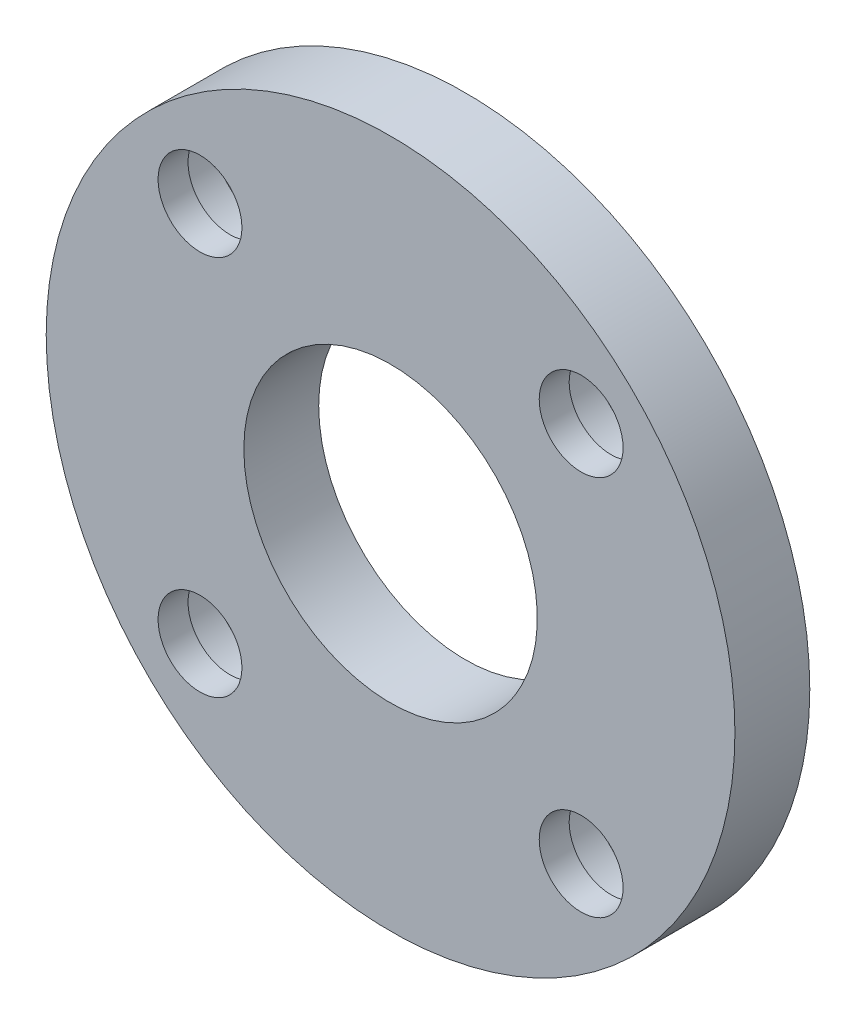
ISO-10303-21;
HEADER;
FILE_DESCRIPTION(('STEP AP214'),'2;1');
FILE_NAME('part.step','',(''),(''),'','','');
FILE_SCHEMA(('AUTOMOTIVE_DESIGN { 1 0 10303 214 1 1 1 1 }'));
ENDSEC;
DATA;
#1=APPLICATION_CONTEXT('core data for automotive mechanical design processes');
#2=APPLICATION_PROTOCOL_DEFINITION('international standard','automotive_design',2000,#1);
#3=PRODUCT_CONTEXT('',#1,'mechanical');
#4=PRODUCT('Part','Part','',(#3));
#5=PRODUCT_RELATED_PRODUCT_CATEGORY('part','',(#4));
#6=PRODUCT_DEFINITION_FORMATION('','',#4);
#7=PRODUCT_DEFINITION_CONTEXT('part definition',#1,'design');
#8=PRODUCT_DEFINITION('design','',#6,#7);
#9=PRODUCT_DEFINITION_SHAPE('','',#8);
#10=(LENGTH_UNIT() NAMED_UNIT(*) SI_UNIT(.MILLI.,.METRE.));
#11=(NAMED_UNIT(*) PLANE_ANGLE_UNIT() SI_UNIT($,.RADIAN.));
#12=(NAMED_UNIT(*) SI_UNIT($,.STERADIAN.) SOLID_ANGLE_UNIT());
#13=UNCERTAINTY_MEASURE_WITH_UNIT(LENGTH_MEASURE(1.E-05),#10,'distance_accuracy_value','');
#14=(GEOMETRIC_REPRESENTATION_CONTEXT(3) GLOBAL_UNCERTAINTY_ASSIGNED_CONTEXT((#13)) GLOBAL_UNIT_ASSIGNED_CONTEXT((#10,
#11,#12)) REPRESENTATION_CONTEXT('',''));
#15=CARTESIAN_POINT('',(0.,0.,0.));
#16=DIRECTION('',(0.,0.,1.));
#17=DIRECTION('',(1.,0.,0.));
#18=AXIS2_PLACEMENT_3D('',#15,#16,#17);
#19=CARTESIAN_POINT('',(-12.7279220613579,12.7279220613579,5.));
#20=DIRECTION('',(0.,0.,-1.));
#21=DIRECTION('',(-1.,0.,0.));
#22=AXIS2_PLACEMENT_3D('',#19,#20,#21);
#23=CYLINDRICAL_SURFACE('',#22,2.8);
#24=CARTESIAN_POINT('',(-12.7279220613579,12.7279220613579,5.));
#25=DIRECTION('',(0.,0.,1.));
#26=DIRECTION('',(1.,0.,0.));
#27=AXIS2_PLACEMENT_3D('',#24,#25,#26);
#28=CIRCLE('',#27,2.8);
#29=CARTESIAN_POINT('',(-9.92792206135786,12.7279220613579,5.));
#30=VERTEX_POINT('',#29);
#31=EDGE_CURVE('E69',#30,#30,#28,.T.);
#32=ORIENTED_EDGE('',*,*,#31,.T.);
#33=EDGE_LOOP('',(#32));
#34=FACE_BOUND('',#33,.T.);
#35=CARTESIAN_POINT('',(-12.7279220613579,12.7279220613579,3.));
#36=DIRECTION('',(0.,0.,-1.));
#37=DIRECTION('',(-1.,0.,0.));
#38=AXIS2_PLACEMENT_3D('',#35,#36,#37);
#39=CIRCLE('',#38,2.8);
#40=CARTESIAN_POINT('',(-15.5279220613579,12.7279220613579,3.));
#41=VERTEX_POINT('',#40);
#42=EDGE_CURVE('E60',#41,#41,#39,.T.);
#43=ORIENTED_EDGE('',*,*,#42,.T.);
#44=EDGE_LOOP('',(#43));
#45=FACE_BOUND('',#44,.T.);
#46=ADVANCED_FACE('F56',(#34,#45),#23,.F.);
#47=CARTESIAN_POINT('',(12.7279220613579,12.7279220613579,5.));
#48=DIRECTION('',(0.,0.,-1.));
#49=DIRECTION('',(-1.,0.,0.));
#50=AXIS2_PLACEMENT_3D('',#47,#48,#49);
#51=CYLINDRICAL_SURFACE('',#50,2.8);
#52=CARTESIAN_POINT('',(12.7279220613579,12.7279220613579,5.));
#53=DIRECTION('',(0.,0.,1.));
#54=DIRECTION('',(1.,0.,0.));
#55=AXIS2_PLACEMENT_3D('',#52,#53,#54);
#56=CIRCLE('',#55,2.8);
#57=CARTESIAN_POINT('',(15.5279220613579,12.7279220613579,5.));
#58=VERTEX_POINT('',#57);
#59=EDGE_CURVE('E94',#58,#58,#56,.T.);
#60=ORIENTED_EDGE('',*,*,#59,.T.);
#61=EDGE_LOOP('',(#60));
#62=FACE_BOUND('',#61,.T.);
#63=CARTESIAN_POINT('',(12.7279220613579,12.7279220613579,3.));
#64=DIRECTION('',(0.,0.,-1.));
#65=DIRECTION('',(-1.,0.,0.));
#66=AXIS2_PLACEMENT_3D('',#63,#64,#65);
#67=CIRCLE('',#66,2.8);
#68=CARTESIAN_POINT('',(9.92792206135785,12.7279220613579,3.));
#69=VERTEX_POINT('',#68);
#70=EDGE_CURVE('E80',#69,#69,#67,.T.);
#71=ORIENTED_EDGE('',*,*,#70,.T.);
#72=EDGE_LOOP('',(#71));
#73=FACE_BOUND('',#72,.T.);
#74=ADVANCED_FACE('F125',(#62,#73),#51,.F.);
#75=CARTESIAN_POINT('',(12.7279220613579,-12.7279220613579,5.));
#76=DIRECTION('',(0.,0.,-1.));
#77=DIRECTION('',(-1.,0.,0.));
#78=AXIS2_PLACEMENT_3D('',#75,#76,#77);
#79=CYLINDRICAL_SURFACE('',#78,2.8);
#80=CARTESIAN_POINT('',(12.7279220613579,-12.7279220613579,5.));
#81=DIRECTION('',(0.,0.,1.));
#82=DIRECTION('',(1.,0.,0.));
#83=AXIS2_PLACEMENT_3D('',#80,#81,#82);
#84=CIRCLE('',#83,2.8);
#85=CARTESIAN_POINT('',(15.5279220613579,-12.7279220613579,5.));
#86=VERTEX_POINT('',#85);
#87=EDGE_CURVE('E89',#86,#86,#84,.T.);
#88=ORIENTED_EDGE('',*,*,#87,.T.);
#89=EDGE_LOOP('',(#88));
#90=FACE_BOUND('',#89,.T.);
#91=CARTESIAN_POINT('',(12.7279220613579,-12.7279220613579,3.));
#92=DIRECTION('',(0.,0.,-1.));
#93=DIRECTION('',(-1.,0.,0.));
#94=AXIS2_PLACEMENT_3D('',#91,#92,#93);
#95=CIRCLE('',#94,2.8);
#96=CARTESIAN_POINT('',(9.92792206135785,-12.7279220613579,3.));
#97=VERTEX_POINT('',#96);
#98=EDGE_CURVE('E77',#97,#97,#95,.T.);
#99=ORIENTED_EDGE('',*,*,#98,.T.);
#100=EDGE_LOOP('',(#99));
#101=FACE_BOUND('',#100,.T.);
#102=ADVANCED_FACE('F119',(#90,#101),#79,.F.);
#103=CARTESIAN_POINT('',(-12.7279220613579,-12.7279220613579,5.));
#104=DIRECTION('',(0.,0.,-1.));
#105=DIRECTION('',(-1.,0.,0.));
#106=AXIS2_PLACEMENT_3D('',#103,#104,#105);
#107=CYLINDRICAL_SURFACE('',#106,2.8);
#108=CARTESIAN_POINT('',(-12.7279220613579,-12.7279220613579,5.));
#109=DIRECTION('',(0.,0.,1.));
#110=DIRECTION('',(1.,0.,0.));
#111=AXIS2_PLACEMENT_3D('',#108,#109,#110);
#112=CIRCLE('',#111,2.8);
#113=CARTESIAN_POINT('',(-9.92792206135786,-12.7279220613579,5.));
#114=VERTEX_POINT('',#113);
#115=EDGE_CURVE('E85',#114,#114,#112,.T.);
#116=ORIENTED_EDGE('',*,*,#115,.T.);
#117=EDGE_LOOP('',(#116));
#118=FACE_BOUND('',#117,.T.);
#119=CARTESIAN_POINT('',(-12.7279220613579,-12.7279220613579,3.));
#120=DIRECTION('',(0.,0.,-1.));
#121=DIRECTION('',(-1.,0.,0.));
#122=AXIS2_PLACEMENT_3D('',#119,#120,#121);
#123=CIRCLE('',#122,2.8);
#124=CARTESIAN_POINT('',(-15.5279220613579,-12.7279220613579,3.));
#125=VERTEX_POINT('',#124);
#126=EDGE_CURVE('E74',#125,#125,#123,.T.);
#127=ORIENTED_EDGE('',*,*,#126,.T.);
#128=EDGE_LOOP('',(#127));
#129=FACE_BOUND('',#128,.T.);
#130=ADVANCED_FACE('F109',(#118,#129),#107,.F.);
#131=CARTESIAN_POINT('',(0.,0.,5.));
#132=DIRECTION('',(0.,0.,1.));
#133=DIRECTION('',(1.,0.,0.));
#134=AXIS2_PLACEMENT_3D('',#131,#132,#133);
#135=PLANE('',#134);
#136=CARTESIAN_POINT('',(0.,0.,5.));
#137=DIRECTION('',(0.,0.,-1.));
#138=DIRECTION('',(-1.,0.,0.));
#139=AXIS2_PLACEMENT_3D('',#136,#137,#138);
#140=CIRCLE('',#139,9.8);
#141=CARTESIAN_POINT('',(-9.8,0.,5.));
#142=VERTEX_POINT('',#141);
#143=EDGE_CURVE('E173',#142,#142,#140,.T.);
#144=ORIENTED_EDGE('',*,*,#143,.T.);
#145=EDGE_LOOP('',(#144));
#146=FACE_BOUND('',#145,.T.);
#147=ORIENTED_EDGE('',*,*,#87,.F.);
#148=EDGE_LOOP('',(#147));
#149=FACE_BOUND('',#148,.T.);
#150=ORIENTED_EDGE('',*,*,#31,.F.);
#151=EDGE_LOOP('',(#150));
#152=FACE_BOUND('',#151,.T.);
#153=CARTESIAN_POINT('',(0.,0.,5.));
#154=DIRECTION('',(0.,0.,1.));
#155=DIRECTION('',(1.,0.,0.));
#156=AXIS2_PLACEMENT_3D('',#153,#154,#155);
#157=CIRCLE('',#156,23.);
#158=CARTESIAN_POINT('',(23.,0.,5.));
#159=VERTEX_POINT('',#158);
#160=EDGE_CURVE('E11',#159,#159,#157,.T.);
#161=ORIENTED_EDGE('',*,*,#160,.T.);
#162=EDGE_LOOP('',(#161));
#163=FACE_BOUND('',#162,.T.);
#164=ORIENTED_EDGE('',*,*,#59,.F.);
#165=EDGE_LOOP('',(#164));
#166=FACE_BOUND('',#165,.T.);
#167=ORIENTED_EDGE('',*,*,#115,.F.);
#168=EDGE_LOOP('',(#167));
#169=FACE_BOUND('',#168,.T.);
#170=ADVANCED_FACE('F106',(#146,#149,#152,#163,#166,#169),#135,.T.);
#171=CARTESIAN_POINT('',(0.,0.,0.));
#172=DIRECTION('',(0.,0.,1.));
#173=DIRECTION('',(1.,0.,0.));
#174=AXIS2_PLACEMENT_3D('',#171,#172,#173);
#175=PLANE('',#174);
#176=CARTESIAN_POINT('',(0.,0.,0.));
#177=DIRECTION('',(0.,0.,-1.));
#178=DIRECTION('',(-1.,0.,0.));
#179=AXIS2_PLACEMENT_3D('',#176,#177,#178);
#180=CIRCLE('',#179,9.8);
#181=CARTESIAN_POINT('',(-9.8,0.,0.));
#182=VERTEX_POINT('',#181);
#183=EDGE_CURVE('E176',#182,#182,#180,.T.);
#184=ORIENTED_EDGE('',*,*,#183,.F.);
#185=EDGE_LOOP('',(#184));
#186=FACE_BOUND('',#185,.T.);
#187=CARTESIAN_POINT('',(12.7279220613579,12.7279220613579,0.));
#188=DIRECTION('',(0.,0.,-1.));
#189=DIRECTION('',(-1.,0.,0.));
#190=AXIS2_PLACEMENT_3D('',#187,#188,#189);
#191=CIRCLE('',#190,4.3);
#192=CARTESIAN_POINT('',(8.42792206135785,12.7279220613579,0.));
#193=VERTEX_POINT('',#192);
#194=EDGE_CURVE('E193',#193,#193,#191,.T.);
#195=ORIENTED_EDGE('',*,*,#194,.F.);
#196=EDGE_LOOP('',(#195));
#197=FACE_BOUND('',#196,.T.);
#198=CARTESIAN_POINT('',(-12.7588246909081,12.7279220613579,0.));
#199=DIRECTION('',(0.,0.,-1.));
#200=DIRECTION('',(-1.,0.,0.));
#201=AXIS2_PLACEMENT_3D('',#198,#199,#200);
#202=CIRCLE('',#201,4.3);
#203=CARTESIAN_POINT('',(-17.0588246909081,12.7279220613579,0.));
#204=VERTEX_POINT('',#203);
#205=EDGE_CURVE('E187',#204,#204,#202,.T.);
#206=ORIENTED_EDGE('',*,*,#205,.F.);
#207=EDGE_LOOP('',(#206));
#208=FACE_BOUND('',#207,.T.);
#209=CARTESIAN_POINT('',(-12.7279220613579,-12.7279220613579,0.));
#210=DIRECTION('',(0.,0.,-1.));
#211=DIRECTION('',(-1.,0.,0.));
#212=AXIS2_PLACEMENT_3D('',#209,#210,#211);
#213=CIRCLE('',#212,4.3);
#214=CARTESIAN_POINT('',(-17.0279220613579,-12.7279220613579,0.));
#215=VERTEX_POINT('',#214);
#216=EDGE_CURVE('E181',#215,#215,#213,.T.);
#217=ORIENTED_EDGE('',*,*,#216,.F.);
#218=EDGE_LOOP('',(#217));
#219=FACE_BOUND('',#218,.T.);
#220=CARTESIAN_POINT('',(12.7279220613579,-12.7279220613579,0.));
#221=DIRECTION('',(0.,0.,-1.));
#222=DIRECTION('',(-1.,0.,0.));
#223=AXIS2_PLACEMENT_3D('',#220,#221,#222);
#224=CIRCLE('',#223,4.3);
#225=CARTESIAN_POINT('',(8.42792206135785,-12.7279220613579,0.));
#226=VERTEX_POINT('',#225);
#227=EDGE_CURVE('E97',#226,#226,#224,.T.);
#228=ORIENTED_EDGE('',*,*,#227,.F.);
#229=EDGE_LOOP('',(#228));
#230=FACE_BOUND('',#229,.T.);
#231=CARTESIAN_POINT('',(0.,0.,0.));
#232=DIRECTION('',(0.,0.,1.));
#233=DIRECTION('',(1.,0.,0.));
#234=AXIS2_PLACEMENT_3D('',#231,#232,#233);
#235=CIRCLE('',#234,23.);
#236=CARTESIAN_POINT('',(23.,0.,0.));
#237=VERTEX_POINT('',#236);
#238=EDGE_CURVE('E64',#237,#237,#235,.T.);
#239=ORIENTED_EDGE('',*,*,#238,.F.);
#240=EDGE_LOOP('',(#239));
#241=FACE_BOUND('',#240,.T.);
#242=ADVANCED_FACE('F108',(#186,#197,#208,#219,#230,#241),#175,.F.);
#243=CARTESIAN_POINT('',(0.,0.,5.));
#244=DIRECTION('',(0.,0.,-1.));
#245=DIRECTION('',(-1.,0.,0.));
#246=AXIS2_PLACEMENT_3D('',#243,#244,#245);
#247=CYLINDRICAL_SURFACE('',#246,23.);
#248=ORIENTED_EDGE('',*,*,#160,.F.);
#249=EDGE_LOOP('',(#248));
#250=FACE_BOUND('',#249,.T.);
#251=ORIENTED_EDGE('',*,*,#238,.T.);
#252=EDGE_LOOP('',(#251));
#253=FACE_BOUND('',#252,.T.);
#254=ADVANCED_FACE('F58',(#250,#253),#247,.T.);
#255=CARTESIAN_POINT('',(-12.7279220613579,-12.7279220613579,3.));
#256=DIRECTION('',(0.,0.,-1.));
#257=DIRECTION('',(-1.,0.,0.));
#258=AXIS2_PLACEMENT_3D('',#255,#256,#257);
#259=CYLINDRICAL_SURFACE('',#258,4.3);
#260=CARTESIAN_POINT('',(-12.7279220613579,-12.7279220613579,3.));
#261=DIRECTION('',(0.,0.,-1.));
#262=DIRECTION('',(-1.,0.,0.));
#263=AXIS2_PLACEMENT_3D('',#260,#261,#262);
#264=CIRCLE('',#263,4.3);
#265=CARTESIAN_POINT('',(-17.0279220613579,-12.7279220613579,3.));
#266=VERTEX_POINT('',#265);
#267=EDGE_CURVE('E184',#266,#266,#264,.T.);
#268=ORIENTED_EDGE('',*,*,#267,.F.);
#269=EDGE_LOOP('',(#268));
#270=FACE_BOUND('',#269,.T.);
#271=ORIENTED_EDGE('',*,*,#216,.T.);
#272=EDGE_LOOP('',(#271));
#273=FACE_BOUND('',#272,.T.);
#274=ADVANCED_FACE('F162',(#270,#273),#259,.F.);
#275=CARTESIAN_POINT('',(-12.7279220613579,-12.7279220613579,3.));
#276=DIRECTION('',(0.,0.,-1.));
#277=DIRECTION('',(-1.,0.,0.));
#278=AXIS2_PLACEMENT_3D('',#275,#276,#277);
#279=PLANE('',#278);
#280=ORIENTED_EDGE('',*,*,#126,.F.);
#281=EDGE_LOOP('',(#280));
#282=FACE_BOUND('',#281,.T.);
#283=ORIENTED_EDGE('',*,*,#267,.T.);
#284=EDGE_LOOP('',(#283));
#285=FACE_BOUND('',#284,.T.);
#286=ADVANCED_FACE('F138',(#282,#285),#279,.T.);
#287=CARTESIAN_POINT('',(12.7279220613579,-12.7279220613579,3.));
#288=DIRECTION('',(0.,0.,-1.));
#289=DIRECTION('',(-1.,0.,0.));
#290=AXIS2_PLACEMENT_3D('',#287,#288,#289);
#291=CYLINDRICAL_SURFACE('',#290,4.3);
#292=CARTESIAN_POINT('',(12.7279220613579,-12.7279220613579,3.));
#293=DIRECTION('',(0.,0.,-1.));
#294=DIRECTION('',(-1.,0.,0.));
#295=AXIS2_PLACEMENT_3D('',#292,#293,#294);
#296=CIRCLE('',#295,4.3);
#297=CARTESIAN_POINT('',(8.42792206135785,-12.7279220613579,3.));
#298=VERTEX_POINT('',#297);
#299=EDGE_CURVE('E78',#298,#298,#296,.T.);
#300=ORIENTED_EDGE('',*,*,#299,.F.);
#301=EDGE_LOOP('',(#300));
#302=FACE_BOUND('',#301,.T.);
#303=ORIENTED_EDGE('',*,*,#227,.T.);
#304=EDGE_LOOP('',(#303));
#305=FACE_BOUND('',#304,.T.);
#306=ADVANCED_FACE('F134',(#302,#305),#291,.F.);
#307=CARTESIAN_POINT('',(12.7279220613579,-12.7279220613579,3.));
#308=DIRECTION('',(0.,0.,-1.));
#309=DIRECTION('',(-1.,0.,0.));
#310=AXIS2_PLACEMENT_3D('',#307,#308,#309);
#311=PLANE('',#310);
#312=ORIENTED_EDGE('',*,*,#98,.F.);
#313=EDGE_LOOP('',(#312));
#314=FACE_BOUND('',#313,.T.);
#315=ORIENTED_EDGE('',*,*,#299,.T.);
#316=EDGE_LOOP('',(#315));
#317=FACE_BOUND('',#316,.T.);
#318=ADVANCED_FACE('F137',(#314,#317),#311,.T.);
#319=CARTESIAN_POINT('',(12.7279220613579,12.7279220613579,3.));
#320=DIRECTION('',(0.,0.,-1.));
#321=DIRECTION('',(-1.,0.,0.));
#322=AXIS2_PLACEMENT_3D('',#319,#320,#321);
#323=CYLINDRICAL_SURFACE('',#322,4.3);
#324=CARTESIAN_POINT('',(12.7279220613579,12.7279220613579,3.));
#325=DIRECTION('',(0.,0.,-1.));
#326=DIRECTION('',(-1.,0.,0.));
#327=AXIS2_PLACEMENT_3D('',#324,#325,#326);
#328=CIRCLE('',#327,4.3);
#329=CARTESIAN_POINT('',(8.42792206135785,12.7279220613579,3.));
#330=VERTEX_POINT('',#329);
#331=EDGE_CURVE('E178',#330,#330,#328,.T.);
#332=ORIENTED_EDGE('',*,*,#331,.F.);
#333=EDGE_LOOP('',(#332));
#334=FACE_BOUND('',#333,.T.);
#335=ORIENTED_EDGE('',*,*,#194,.T.);
#336=EDGE_LOOP('',(#335));
#337=FACE_BOUND('',#336,.T.);
#338=ADVANCED_FACE('F142',(#334,#337),#323,.F.);
#339=CARTESIAN_POINT('',(12.7279220613579,12.7279220613579,3.));
#340=DIRECTION('',(0.,0.,-1.));
#341=DIRECTION('',(-1.,0.,0.));
#342=AXIS2_PLACEMENT_3D('',#339,#340,#341);
#343=PLANE('',#342);
#344=ORIENTED_EDGE('',*,*,#70,.F.);
#345=EDGE_LOOP('',(#344));
#346=FACE_BOUND('',#345,.T.);
#347=ORIENTED_EDGE('',*,*,#331,.T.);
#348=EDGE_LOOP('',(#347));
#349=FACE_BOUND('',#348,.T.);
#350=ADVANCED_FACE('F144',(#346,#349),#343,.T.);
#351=CARTESIAN_POINT('',(-12.7588246909081,12.7279220613579,3.));
#352=DIRECTION('',(0.,0.,-1.));
#353=DIRECTION('',(-1.,0.,0.));
#354=AXIS2_PLACEMENT_3D('',#351,#352,#353);
#355=CYLINDRICAL_SURFACE('',#354,4.3);
#356=CARTESIAN_POINT('',(-12.7588246909081,12.7279220613579,3.));
#357=DIRECTION('',(0.,0.,-1.));
#358=DIRECTION('',(-1.,0.,0.));
#359=AXIS2_PLACEMENT_3D('',#356,#357,#358);
#360=CIRCLE('',#359,4.3);
#361=CARTESIAN_POINT('',(-17.0588246909081,12.7279220613579,3.));
#362=VERTEX_POINT('',#361);
#363=EDGE_CURVE('E190',#362,#362,#360,.T.);
#364=ORIENTED_EDGE('',*,*,#363,.F.);
#365=EDGE_LOOP('',(#364));
#366=FACE_BOUND('',#365,.T.);
#367=ORIENTED_EDGE('',*,*,#205,.T.);
#368=EDGE_LOOP('',(#367));
#369=FACE_BOUND('',#368,.T.);
#370=ADVANCED_FACE('F147',(#366,#369),#355,.F.);
#371=CARTESIAN_POINT('',(-12.7588246909081,12.7279220613579,3.));
#372=DIRECTION('',(0.,0.,-1.));
#373=DIRECTION('',(-1.,0.,0.));
#374=AXIS2_PLACEMENT_3D('',#371,#372,#373);
#375=PLANE('',#374);
#376=ORIENTED_EDGE('',*,*,#42,.F.);
#377=EDGE_LOOP('',(#376));
#378=FACE_BOUND('',#377,.T.);
#379=ORIENTED_EDGE('',*,*,#363,.T.);
#380=EDGE_LOOP('',(#379));
#381=FACE_BOUND('',#380,.T.);
#382=ADVANCED_FACE('F152',(#378,#381),#375,.T.);
#383=CARTESIAN_POINT('',(0.,0.,5.));
#384=DIRECTION('',(0.,0.,-1.));
#385=DIRECTION('',(-1.,0.,0.));
#386=AXIS2_PLACEMENT_3D('',#383,#384,#385);
#387=CYLINDRICAL_SURFACE('',#386,9.8);
#388=ORIENTED_EDGE('',*,*,#143,.F.);
#389=EDGE_LOOP('',(#388));
#390=FACE_BOUND('',#389,.T.);
#391=ORIENTED_EDGE('',*,*,#183,.T.);
#392=EDGE_LOOP('',(#391));
#393=FACE_BOUND('',#392,.T.);
#394=ADVANCED_FACE('F155',(#390,#393),#387,.F.);
#395=CLOSED_SHELL('',(#46,#74,#102,#130,#170,#242,#254,#274,#286,#306,#318,#338,#350,#370,#382,#394));
#396=MANIFOLD_SOLID_BREP('B2',#395);
#397=ADVANCED_BREP_SHAPE_REPRESENTATION('',(#18,#396),#14);
#398=SHAPE_DEFINITION_REPRESENTATION(#9,#397);
ENDSEC;
END-ISO-10303-21;
